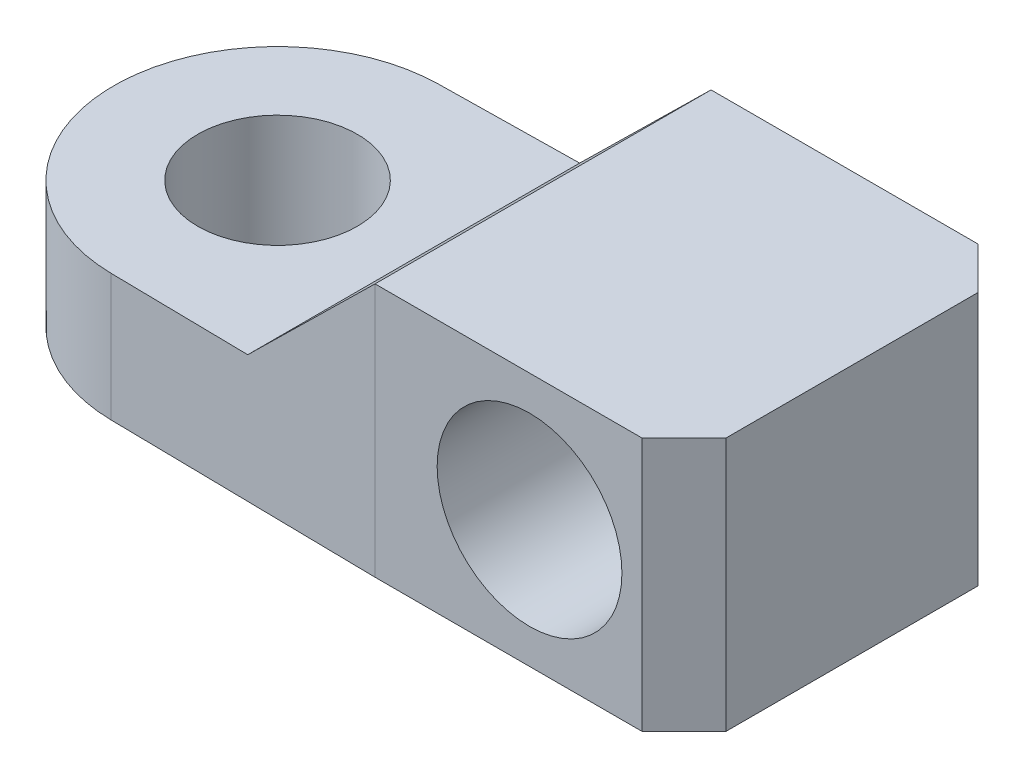
ISO-10303-21;
HEADER;
FILE_DESCRIPTION(('STEP AP214'),'2;1');
FILE_NAME('part.step','',(''),(''),'','','');
FILE_SCHEMA(('AUTOMOTIVE_DESIGN { 1 0 10303 214 1 1 1 1 }'));
ENDSEC;
DATA;
#1=APPLICATION_CONTEXT('core data for automotive mechanical design processes');
#2=APPLICATION_PROTOCOL_DEFINITION('international standard','automotive_design',2000,#1);
#3=PRODUCT_CONTEXT('',#1,'mechanical');
#4=PRODUCT('Part','Part','',(#3));
#5=PRODUCT_RELATED_PRODUCT_CATEGORY('part','',(#4));
#6=PRODUCT_DEFINITION_FORMATION('','',#4);
#7=PRODUCT_DEFINITION_CONTEXT('part definition',#1,'design');
#8=PRODUCT_DEFINITION('design','',#6,#7);
#9=PRODUCT_DEFINITION_SHAPE('','',#8);
#10=(LENGTH_UNIT() NAMED_UNIT(*) SI_UNIT(.MILLI.,.METRE.));
#11=(NAMED_UNIT(*) PLANE_ANGLE_UNIT() SI_UNIT($,.RADIAN.));
#12=(NAMED_UNIT(*) SI_UNIT($,.STERADIAN.) SOLID_ANGLE_UNIT());
#13=UNCERTAINTY_MEASURE_WITH_UNIT(LENGTH_MEASURE(1.E-05),#10,'distance_accuracy_value','');
#14=(GEOMETRIC_REPRESENTATION_CONTEXT(3) GLOBAL_UNCERTAINTY_ASSIGNED_CONTEXT((#13)) GLOBAL_UNIT_ASSIGNED_CONTEXT((#10,
#11,#12)) REPRESENTATION_CONTEXT('',''));
#15=CARTESIAN_POINT('',(0.,0.,0.));
#16=DIRECTION('',(0.,0.,1.));
#17=DIRECTION('',(1.,0.,0.));
#18=AXIS2_PLACEMENT_3D('',#15,#16,#17);
#19=CARTESIAN_POINT('',(-0.0613838784445087,6.05,-3.89951689565093));
#20=DIRECTION('',(-0.0157394560114125,0.,-0.999876127089983));
#21=DIRECTION('',(-0.999876127089984,0.,0.0157394560114125));
#22=AXIS2_PLACEMENT_3D('',#19,#20,#21);
#23=PLANE('',#22);
#24=DIRECTION('',(0.,-1.,0.));
#25=VECTOR('',#24,1.);
#26=CARTESIAN_POINT('',(-0.0613838784445082,6.05,-3.89951689565093));
#27=LINE('',#26,#25);
#28=CARTESIAN_POINT('',(-0.0613838784445082,3.025,-3.89951689565093));
#29=VERTEX_POINT('',#28);
#30=CARTESIAN_POINT('',(-0.0613838784445082,0.,-3.89951689565093));
#31=VERTEX_POINT('',#30);
#32=EDGE_CURVE('E178',#29,#31,#27,.T.);
#33=ORIENTED_EDGE('',*,*,#32,.F.);
#34=DIRECTION('',(0.999876127089984,0.,-0.0157394560114125));
#35=VECTOR('',#34,1.);
#36=CARTESIAN_POINT('',(-0.0613838784445087,3.025,-3.89951689565093));
#37=LINE('',#36,#35);
#38=CARTESIAN_POINT('',(3.2418601585521,3.025,-3.95151460097328));
#39=VERTEX_POINT('',#38);
#40=EDGE_CURVE('E140',#29,#39,#37,.T.);
#41=ORIENTED_EDGE('',*,*,#40,.T.);
#42=DIRECTION('',(0.713416670590464,0.700650081816092,-0.0112301814198194));
#43=VECTOR('',#42,1.);
#44=CARTESIAN_POINT('',(3.07227615816136,2.85845070469108,-3.94884511038132));
#45=LINE('',#44,#43);
#46=CARTESIAN_POINT('',(6.32197887193665,6.05,-3.99999999999999));
#47=VERTEX_POINT('',#46);
#48=EDGE_CURVE('E129',#39,#47,#45,.T.);
#49=ORIENTED_EDGE('',*,*,#48,.T.);
#50=DIRECTION('',(0.,-1.,0.));
#51=VECTOR('',#50,1.);
#52=CARTESIAN_POINT('',(6.32197887193665,6.05,-3.99999999999999));
#53=LINE('',#52,#51);
#54=CARTESIAN_POINT('',(6.32197887193665,0.,-3.99999999999999));
#55=VERTEX_POINT('',#54);
#56=EDGE_CURVE('E155',#47,#55,#53,.T.);
#57=ORIENTED_EDGE('',*,*,#56,.T.);
#58=DIRECTION('',(0.999876127089984,0.,-0.0157394560114125));
#59=VECTOR('',#58,1.);
#60=CARTESIAN_POINT('',(-0.0613838784445087,0.,-3.89951689565093));
#61=LINE('',#60,#59);
#62=EDGE_CURVE('E158',#31,#55,#61,.T.);
#63=ORIENTED_EDGE('',*,*,#62,.F.);
#64=EDGE_LOOP('',(#33,#41,#49,#57,#63));
#65=FACE_BOUND('',#64,.T.);
#66=ADVANCED_FACE('F37',(#65),#23,.T.);
#67=CARTESIAN_POINT('',(0.,6.05,0.));
#68=DIRECTION('',(0.,-1.,0.));
#69=DIRECTION('',(0.,0.,-1.));
#70=AXIS2_PLACEMENT_3D('',#67,#68,#69);
#71=CYLINDRICAL_SURFACE('',#70,3.9);
#72=CARTESIAN_POINT('',(0.,3.025,0.));
#73=DIRECTION('',(0.,1.,0.));
#74=DIRECTION('',(0.,0.,1.));
#75=AXIS2_PLACEMENT_3D('',#72,#73,#74);
#76=CIRCLE('',#75,3.9);
#77=CARTESIAN_POINT('',(-0.0613838784445082,3.025,3.89951689565094));
#78=VERTEX_POINT('',#77);
#79=EDGE_CURVE('E120',#29,#78,#76,.T.);
#80=ORIENTED_EDGE('',*,*,#79,.F.);
#81=ORIENTED_EDGE('',*,*,#32,.T.);
#82=CARTESIAN_POINT('',(0.,0.,0.));
#83=DIRECTION('',(0.,1.,0.));
#84=DIRECTION('',(0.,0.,1.));
#85=AXIS2_PLACEMENT_3D('',#82,#83,#84);
#86=CIRCLE('',#85,3.9);
#87=CARTESIAN_POINT('',(-0.0613838784445082,0.,3.89951689565094));
#88=VERTEX_POINT('',#87);
#89=EDGE_CURVE('E161',#31,#88,#86,.T.);
#90=ORIENTED_EDGE('',*,*,#89,.T.);
#91=DIRECTION('',(0.,-1.,0.));
#92=VECTOR('',#91,1.);
#93=CARTESIAN_POINT('',(-0.0613838784445082,6.05,3.89951689565094));
#94=LINE('',#93,#92);
#95=EDGE_CURVE('E176',#78,#88,#94,.T.);
#96=ORIENTED_EDGE('',*,*,#95,.F.);
#97=EDGE_LOOP('',(#80,#81,#90,#96));
#98=FACE_BOUND('',#97,.T.);
#99=ADVANCED_FACE('F227',(#98),#71,.T.);
#100=CARTESIAN_POINT('',(-0.0613838784445087,6.05,3.89951689565094));
#101=DIRECTION('',(-0.0157394560114125,0.,0.999876127089983));
#102=DIRECTION('',(0.999876127089984,0.,0.0157394560114125));
#103=AXIS2_PLACEMENT_3D('',#100,#101,#102);
#104=PLANE('',#103);
#105=DIRECTION('',(-0.713416670590464,-0.700650081816092,-0.0112301814198194));
#106=VECTOR('',#105,1.);
#107=CARTESIAN_POINT('',(3.07227615816136,2.85845070469108,3.94884511038132));
#108=LINE('',#107,#106);
#109=CARTESIAN_POINT('',(6.32197887193665,6.05,3.99999999999999));
#110=VERTEX_POINT('',#109);
#111=CARTESIAN_POINT('',(3.2418601585521,3.025,3.95151460097328));
#112=VERTEX_POINT('',#111);
#113=EDGE_CURVE('E127',#110,#112,#108,.T.);
#114=ORIENTED_EDGE('',*,*,#113,.T.);
#115=DIRECTION('',(-0.999876127089984,0.,-0.0157394560114125));
#116=VECTOR('',#115,1.);
#117=CARTESIAN_POINT('',(-0.0613838784445087,3.025,3.89951689565094));
#118=LINE('',#117,#116);
#119=EDGE_CURVE('E114',#112,#78,#118,.T.);
#120=ORIENTED_EDGE('',*,*,#119,.T.);
#121=ORIENTED_EDGE('',*,*,#95,.T.);
#122=DIRECTION('',(-0.999876127089984,0.,-0.0157394560114125));
#123=VECTOR('',#122,1.);
#124=CARTESIAN_POINT('',(-0.0613838784445087,0.,3.89951689565094));
#125=LINE('',#124,#123);
#126=CARTESIAN_POINT('',(6.32197887193665,0.,3.99999999999999));
#127=VERTEX_POINT('',#126);
#128=EDGE_CURVE('E164',#127,#88,#125,.T.);
#129=ORIENTED_EDGE('',*,*,#128,.F.);
#130=DIRECTION('',(0.,-1.,0.));
#131=VECTOR('',#130,1.);
#132=CARTESIAN_POINT('',(6.32197887193665,6.05,3.99999999999999));
#133=LINE('',#132,#131);
#134=EDGE_CURVE('E135',#110,#127,#133,.T.);
#135=ORIENTED_EDGE('',*,*,#134,.F.);
#136=EDGE_LOOP('',(#114,#120,#121,#129,#135));
#137=FACE_BOUND('',#136,.T.);
#138=ADVANCED_FACE('F132',(#137),#104,.T.);
#139=CARTESIAN_POINT('',(0.,6.05,0.));
#140=DIRECTION('',(0.,-1.,0.));
#141=DIRECTION('',(0.,0.,-1.));
#142=AXIS2_PLACEMENT_3D('',#139,#140,#141);
#143=CYLINDRICAL_SURFACE('',#142,1.9);
#144=CARTESIAN_POINT('',(0.,0.,0.));
#145=DIRECTION('',(0.,1.,0.));
#146=DIRECTION('',(0.,0.,1.));
#147=AXIS2_PLACEMENT_3D('',#144,#145,#146);
#148=CIRCLE('',#147,1.9);
#149=CARTESIAN_POINT('',(0.,0.,1.9));
#150=VERTEX_POINT('',#149);
#151=EDGE_CURVE('E146',#150,#150,#148,.T.);
#152=ORIENTED_EDGE('',*,*,#151,.F.);
#153=EDGE_LOOP('',(#152));
#154=FACE_BOUND('',#153,.T.);
#155=CARTESIAN_POINT('',(0.,3.025,0.));
#156=DIRECTION('',(0.,1.,0.));
#157=DIRECTION('',(0.,0.,1.));
#158=AXIS2_PLACEMENT_3D('',#155,#156,#157);
#159=CIRCLE('',#158,1.9);
#160=CARTESIAN_POINT('',(0.,3.025,1.9));
#161=VERTEX_POINT('',#160);
#162=EDGE_CURVE('E42',#161,#161,#159,.T.);
#163=ORIENTED_EDGE('',*,*,#162,.T.);
#164=EDGE_LOOP('',(#163));
#165=FACE_BOUND('',#164,.T.);
#166=ADVANCED_FACE('F236',(#154,#165),#143,.F.);
#167=CARTESIAN_POINT('',(0.,6.05,0.));
#168=DIRECTION('',(0.,1.,0.));
#169=DIRECTION('',(0.,0.,1.));
#170=AXIS2_PLACEMENT_3D('',#167,#168,#169);
#171=PLANE('',#170);
#172=DIRECTION('',(1.,0.,0.));
#173=VECTOR('',#172,1.);
#174=CARTESIAN_POINT('',(0.,6.05,-3.99999999999999));
#175=LINE('',#174,#173);
#176=CARTESIAN_POINT('',(12.6780211280634,6.05,-3.99999999999999));
#177=VERTEX_POINT('',#176);
#178=EDGE_CURVE('E153',#47,#177,#175,.T.);
#179=ORIENTED_EDGE('',*,*,#178,.F.);
#180=DIRECTION('',(0.,0.,1.));
#181=VECTOR('',#180,1.);
#182=CARTESIAN_POINT('',(6.32197887193664,6.05,0.));
#183=LINE('',#182,#181);
#184=EDGE_CURVE('E11',#47,#110,#183,.T.);
#185=ORIENTED_EDGE('',*,*,#184,.T.);
#186=DIRECTION('',(-1.,0.,0.));
#187=VECTOR('',#186,1.);
#188=CARTESIAN_POINT('',(0.,6.05,3.99999999999998));
#189=LINE('',#188,#187);
#190=CARTESIAN_POINT('',(12.6780211280633,6.05,4.00000000000001));
#191=VERTEX_POINT('',#190);
#192=EDGE_CURVE('E147',#191,#110,#189,.T.);
#193=ORIENTED_EDGE('',*,*,#192,.F.);
#194=DIRECTION('',(-0.707106781186551,0.,0.707106781186544));
#195=VECTOR('',#194,1.);
#196=CARTESIAN_POINT('',(8.33901056403162,6.05,8.3390105640317));
#197=LINE('',#196,#195);
#198=CARTESIAN_POINT('',(13.6780211280634,6.05,3.00000000000001));
#199=VERTEX_POINT('',#198);
#200=EDGE_CURVE('E193',#191,#199,#197,.F.);
#201=ORIENTED_EDGE('',*,*,#200,.T.);
#202=DIRECTION('',(0.,0.,1.));
#203=VECTOR('',#202,1.);
#204=CARTESIAN_POINT('',(13.6780211280634,6.05,0.));
#205=LINE('',#204,#203);
#206=CARTESIAN_POINT('',(13.6780211280634,6.05,-2.99999999999999));
#207=VERTEX_POINT('',#206);
#208=EDGE_CURVE('E149',#207,#199,#205,.T.);
#209=ORIENTED_EDGE('',*,*,#208,.F.);
#210=DIRECTION('',(0.707106781186546,0.,0.707106781186549));
#211=VECTOR('',#210,1.);
#212=CARTESIAN_POINT('',(8.33901056403169,6.05,-8.33901056403167));
#213=LINE('',#212,#211);
#214=EDGE_CURVE('E54',#207,#177,#213,.F.);
#215=ORIENTED_EDGE('',*,*,#214,.T.);
#216=EDGE_LOOP('',(#179,#185,#193,#201,#209,#215));
#217=FACE_BOUND('',#216,.T.);
#218=ADVANCED_FACE('F209',(#217),#171,.T.);
#219=CARTESIAN_POINT('',(0.,6.05,3.99999999999998));
#220=DIRECTION('',(0.,0.,1.));
#221=DIRECTION('',(1.,0.,0.));
#222=AXIS2_PLACEMENT_3D('',#219,#220,#221);
#223=PLANE('',#222);
#224=CARTESIAN_POINT('',(10.,3.025,4.));
#225=DIRECTION('',(0.,0.,1.));
#226=DIRECTION('',(1.,0.,0.));
#227=AXIS2_PLACEMENT_3D('',#224,#225,#226);
#228=CIRCLE('',#227,2.2);
#229=CARTESIAN_POINT('',(12.2,3.025,4.00000000000001));
#230=VERTEX_POINT('',#229);
#231=EDGE_CURVE('E143',#230,#230,#228,.F.);
#232=ORIENTED_EDGE('',*,*,#231,.T.);
#233=EDGE_LOOP('',(#232));
#234=FACE_BOUND('',#233,.T.);
#235=DIRECTION('',(-1.,0.,0.));
#236=VECTOR('',#235,1.);
#237=CARTESIAN_POINT('',(0.,0.,3.99999999999998));
#238=LINE('',#237,#236);
#239=CARTESIAN_POINT('',(12.6780211280633,0.,4.00000000000001));
#240=VERTEX_POINT('',#239);
#241=EDGE_CURVE('E167',#240,#127,#238,.T.);
#242=ORIENTED_EDGE('',*,*,#241,.F.);
#243=DIRECTION('',(0.,1.,0.));
#244=VECTOR('',#243,1.);
#245=CARTESIAN_POINT('',(12.6780211280633,6.05,4.00000000000001));
#246=LINE('',#245,#244);
#247=EDGE_CURVE('E62',#240,#191,#246,.T.);
#248=ORIENTED_EDGE('',*,*,#247,.T.);
#249=ORIENTED_EDGE('',*,*,#192,.T.);
#250=ORIENTED_EDGE('',*,*,#134,.T.);
#251=EDGE_LOOP('',(#242,#248,#249,#250));
#252=FACE_BOUND('',#251,.T.);
#253=ADVANCED_FACE('F211',(#234,#252),#223,.T.);
#254=CARTESIAN_POINT('',(13.6780211280634,6.05,0.));
#255=DIRECTION('',(1.,0.,0.));
#256=DIRECTION('',(0.,0.,-1.));
#257=AXIS2_PLACEMENT_3D('',#254,#255,#256);
#258=PLANE('',#257);
#259=ORIENTED_EDGE('',*,*,#208,.T.);
#260=DIRECTION('',(0.,-1.,0.));
#261=VECTOR('',#260,1.);
#262=CARTESIAN_POINT('',(13.6780211280634,6.05,3.00000000000001));
#263=LINE('',#262,#261);
#264=CARTESIAN_POINT('',(13.6780211280634,0.,3.00000000000001));
#265=VERTEX_POINT('',#264);
#266=EDGE_CURVE('E184',#199,#265,#263,.T.);
#267=ORIENTED_EDGE('',*,*,#266,.T.);
#268=DIRECTION('',(0.,0.,1.));
#269=VECTOR('',#268,1.);
#270=CARTESIAN_POINT('',(13.6780211280634,0.,0.));
#271=LINE('',#270,#269);
#272=CARTESIAN_POINT('',(13.6780211280634,0.,-2.99999999999999));
#273=VERTEX_POINT('',#272);
#274=EDGE_CURVE('E169',#273,#265,#271,.T.);
#275=ORIENTED_EDGE('',*,*,#274,.F.);
#276=DIRECTION('',(0.,1.,0.));
#277=VECTOR('',#276,1.);
#278=CARTESIAN_POINT('',(13.6780211280634,6.05,-2.99999999999999));
#279=LINE('',#278,#277);
#280=EDGE_CURVE('E180',#273,#207,#279,.T.);
#281=ORIENTED_EDGE('',*,*,#280,.T.);
#282=EDGE_LOOP('',(#259,#267,#275,#281));
#283=FACE_BOUND('',#282,.T.);
#284=ADVANCED_FACE('F216',(#283),#258,.T.);
#285=CARTESIAN_POINT('',(0.,6.05,-3.99999999999999));
#286=DIRECTION('',(0.,0.,-1.));
#287=DIRECTION('',(-1.,0.,0.));
#288=AXIS2_PLACEMENT_3D('',#285,#286,#287);
#289=PLANE('',#288);
#290=CARTESIAN_POINT('',(10.,3.025,-3.99999999999999));
#291=DIRECTION('',(0.,0.,-1.));
#292=DIRECTION('',(-1.,0.,0.));
#293=AXIS2_PLACEMENT_3D('',#290,#291,#292);
#294=CIRCLE('',#293,2.2);
#295=CARTESIAN_POINT('',(7.8,3.025,-3.99999999999999));
#296=VERTEX_POINT('',#295);
#297=EDGE_CURVE('E142',#296,#296,#294,.F.);
#298=ORIENTED_EDGE('',*,*,#297,.T.);
#299=EDGE_LOOP('',(#298));
#300=FACE_BOUND('',#299,.T.);
#301=ORIENTED_EDGE('',*,*,#178,.T.);
#302=DIRECTION('',(0.,-1.,0.));
#303=VECTOR('',#302,1.);
#304=CARTESIAN_POINT('',(12.6780211280634,6.05,-3.99999999999999));
#305=LINE('',#304,#303);
#306=CARTESIAN_POINT('',(12.6780211280634,0.,-3.99999999999999));
#307=VERTEX_POINT('',#306);
#308=EDGE_CURVE('E47',#177,#307,#305,.T.);
#309=ORIENTED_EDGE('',*,*,#308,.T.);
#310=DIRECTION('',(1.,0.,0.));
#311=VECTOR('',#310,1.);
#312=CARTESIAN_POINT('',(0.,0.,-3.99999999999999));
#313=LINE('',#312,#311);
#314=EDGE_CURVE('E150',#55,#307,#313,.T.);
#315=ORIENTED_EDGE('',*,*,#314,.F.);
#316=ORIENTED_EDGE('',*,*,#56,.F.);
#317=EDGE_LOOP('',(#301,#309,#315,#316));
#318=FACE_BOUND('',#317,.T.);
#319=ADVANCED_FACE('F199',(#300,#318),#289,.T.);
#320=CARTESIAN_POINT('',(0.,0.,0.));
#321=DIRECTION('',(0.,1.,0.));
#322=DIRECTION('',(0.,0.,1.));
#323=AXIS2_PLACEMENT_3D('',#320,#321,#322);
#324=PLANE('',#323);
#325=ORIENTED_EDGE('',*,*,#151,.T.);
#326=EDGE_LOOP('',(#325));
#327=FACE_BOUND('',#326,.T.);
#328=ORIENTED_EDGE('',*,*,#274,.T.);
#329=DIRECTION('',(0.707106781186551,0.,-0.707106781186544));
#330=VECTOR('',#329,1.);
#331=CARTESIAN_POINT('',(13.6780211280634,0.,3.00000000000001));
#332=LINE('',#331,#330);
#333=EDGE_CURVE('E189',#265,#240,#332,.F.);
#334=ORIENTED_EDGE('',*,*,#333,.T.);
#335=ORIENTED_EDGE('',*,*,#241,.T.);
#336=ORIENTED_EDGE('',*,*,#128,.T.);
#337=ORIENTED_EDGE('',*,*,#89,.F.);
#338=ORIENTED_EDGE('',*,*,#62,.T.);
#339=ORIENTED_EDGE('',*,*,#314,.T.);
#340=DIRECTION('',(-0.707106781186546,0.,-0.707106781186549));
#341=VECTOR('',#340,1.);
#342=CARTESIAN_POINT('',(12.6780211280634,0.,-3.99999999999999));
#343=LINE('',#342,#341);
#344=EDGE_CURVE('E187',#307,#273,#343,.F.);
#345=ORIENTED_EDGE('',*,*,#344,.T.);
#346=EDGE_LOOP('',(#328,#334,#335,#336,#337,#338,#339,#345));
#347=FACE_BOUND('',#346,.T.);
#348=ADVANCED_FACE('F203',(#327,#347),#324,.F.);
#349=CARTESIAN_POINT('',(10.,3.025,19.));
#350=DIRECTION('',(0.,0.,-1.));
#351=DIRECTION('',(-1.,0.,0.));
#352=AXIS2_PLACEMENT_3D('',#349,#350,#351);
#353=CYLINDRICAL_SURFACE('',#352,2.2);
#354=ORIENTED_EDGE('',*,*,#231,.F.);
#355=EDGE_LOOP('',(#354));
#356=FACE_BOUND('',#355,.T.);
#357=ORIENTED_EDGE('',*,*,#297,.F.);
#358=EDGE_LOOP('',(#357));
#359=FACE_BOUND('',#358,.T.);
#360=ADVANCED_FACE('F225',(#356,#359),#353,.F.);
#361=CARTESIAN_POINT('',(13.6780211280634,6.05,3.00000000000001));
#362=DIRECTION('',(-0.707106781186544,0.,-0.70710678118655));
#363=DIRECTION('',(0.,-1.,0.));
#364=AXIS2_PLACEMENT_3D('',#361,#362,#363);
#365=PLANE('',#364);
#366=ORIENTED_EDGE('',*,*,#200,.F.);
#367=ORIENTED_EDGE('',*,*,#247,.F.);
#368=ORIENTED_EDGE('',*,*,#333,.F.);
#369=ORIENTED_EDGE('',*,*,#266,.F.);
#370=EDGE_LOOP('',(#366,#367,#368,#369));
#371=FACE_BOUND('',#370,.T.);
#372=ADVANCED_FACE('F214',(#371),#365,.F.);
#373=CARTESIAN_POINT('',(12.6780211280634,6.05,-3.99999999999999));
#374=DIRECTION('',(-0.707106781186549,0.,0.707106781186546));
#375=DIRECTION('',(0.,-1.,0.));
#376=AXIS2_PLACEMENT_3D('',#373,#374,#375);
#377=PLANE('',#376);
#378=ORIENTED_EDGE('',*,*,#214,.F.);
#379=ORIENTED_EDGE('',*,*,#280,.F.);
#380=ORIENTED_EDGE('',*,*,#344,.F.);
#381=ORIENTED_EDGE('',*,*,#308,.F.);
#382=EDGE_LOOP('',(#378,#379,#380,#381));
#383=FACE_BOUND('',#382,.T.);
#384=ADVANCED_FACE('F40',(#383),#377,.F.);
#385=CARTESIAN_POINT('',(-3.9,3.025,10.));
#386=DIRECTION('',(0.,1.,0.));
#387=DIRECTION('',(0.,0.,1.));
#388=AXIS2_PLACEMENT_3D('',#385,#386,#387);
#389=PLANE('',#388);
#390=ORIENTED_EDGE('',*,*,#162,.F.);
#391=EDGE_LOOP('',(#390));
#392=FACE_BOUND('',#391,.T.);
#393=ORIENTED_EDGE('',*,*,#79,.T.);
#394=ORIENTED_EDGE('',*,*,#119,.F.);
#395=DIRECTION('',(0.,0.,-1.));
#396=VECTOR('',#395,1.);
#397=CARTESIAN_POINT('',(3.2418601585521,3.025,10.));
#398=LINE('',#397,#396);
#399=EDGE_CURVE('E117',#112,#39,#398,.T.);
#400=ORIENTED_EDGE('',*,*,#399,.T.);
#401=ORIENTED_EDGE('',*,*,#40,.F.);
#402=EDGE_LOOP('',(#393,#394,#400,#401));
#403=FACE_BOUND('',#402,.T.);
#404=ADVANCED_FACE('F116',(#392,#403),#389,.T.);
#405=CARTESIAN_POINT('',(3.2418601585521,3.025,10.));
#406=DIRECTION('',(-0.700694267929928,0.713461661822232,0.));
#407=DIRECTION('',(-0.713461661822233,-0.700694267929929,0.));
#408=AXIS2_PLACEMENT_3D('',#405,#406,#407);
#409=PLANE('',#408);
#410=ORIENTED_EDGE('',*,*,#399,.F.);
#411=ORIENTED_EDGE('',*,*,#113,.F.);
#412=ORIENTED_EDGE('',*,*,#184,.F.);
#413=ORIENTED_EDGE('',*,*,#48,.F.);
#414=EDGE_LOOP('',(#410,#411,#412,#413));
#415=FACE_BOUND('',#414,.T.);
#416=ADVANCED_FACE('F126',(#415),#409,.T.);
#417=CLOSED_SHELL('',(#66,#99,#138,#166,#218,#253,#284,#319,#348,#360,#372,#384,#404,#416));
#418=MANIFOLD_SOLID_BREP('B2',#417);
#419=ADVANCED_BREP_SHAPE_REPRESENTATION('',(#18,#418),#14);
#420=SHAPE_DEFINITION_REPRESENTATION(#9,#419);
ENDSEC;
END-ISO-10303-21;
